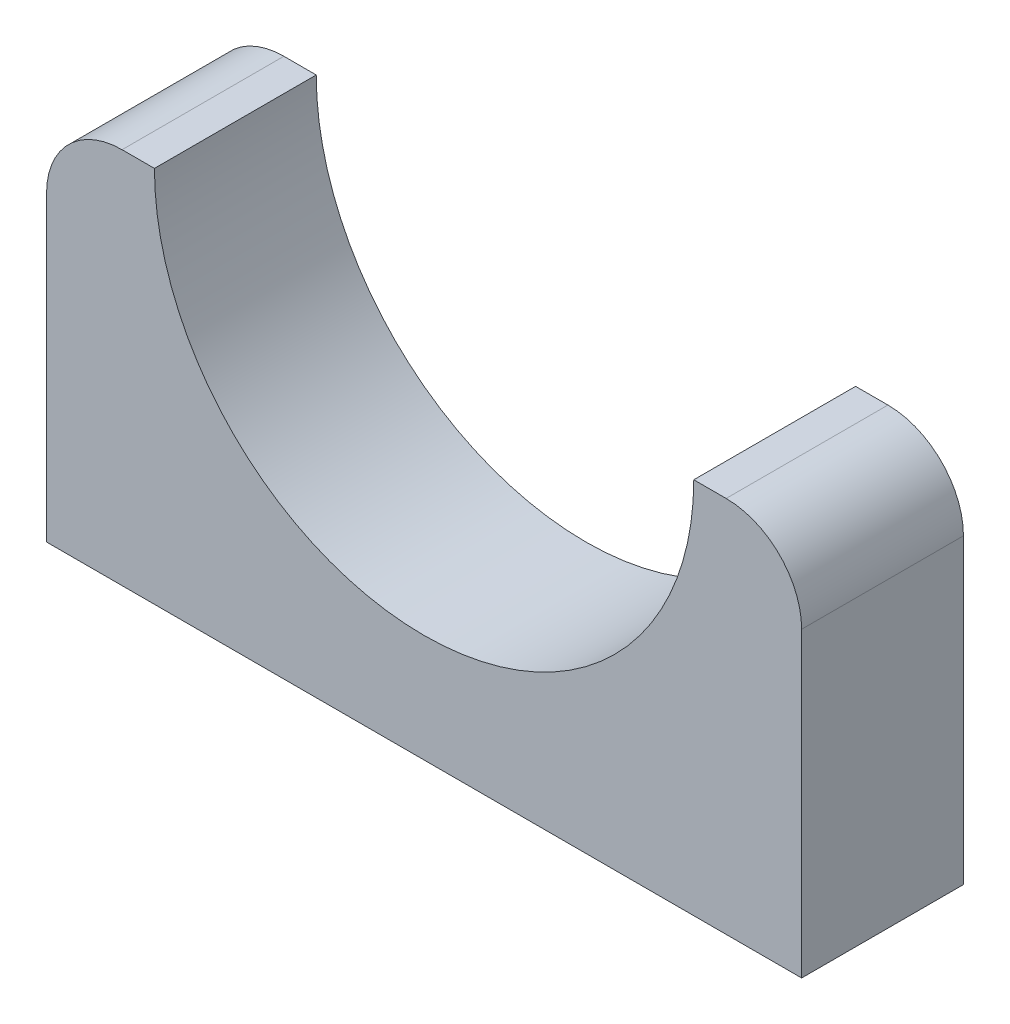
ISO-10303-21;
HEADER;
FILE_DESCRIPTION(('STEP AP214'),'2;1');
FILE_NAME('part.step','',(''),(''),'','','');
FILE_SCHEMA(('AUTOMOTIVE_DESIGN { 1 0 10303 214 1 1 1 1 }'));
ENDSEC;
DATA;
#1=APPLICATION_CONTEXT('core data for automotive mechanical design processes');
#2=APPLICATION_PROTOCOL_DEFINITION('international standard','automotive_design',2000,#1);
#3=PRODUCT_CONTEXT('',#1,'mechanical');
#4=PRODUCT('Part','Part','',(#3));
#5=PRODUCT_RELATED_PRODUCT_CATEGORY('part','',(#4));
#6=PRODUCT_DEFINITION_FORMATION('','',#4);
#7=PRODUCT_DEFINITION_CONTEXT('part definition',#1,'design');
#8=PRODUCT_DEFINITION('design','',#6,#7);
#9=PRODUCT_DEFINITION_SHAPE('','',#8);
#10=(LENGTH_UNIT() NAMED_UNIT(*) SI_UNIT(.MILLI.,.METRE.));
#11=(NAMED_UNIT(*) PLANE_ANGLE_UNIT() SI_UNIT($,.RADIAN.));
#12=(NAMED_UNIT(*) SI_UNIT($,.STERADIAN.) SOLID_ANGLE_UNIT());
#13=UNCERTAINTY_MEASURE_WITH_UNIT(LENGTH_MEASURE(1.E-05),#10,'distance_accuracy_value','');
#14=(GEOMETRIC_REPRESENTATION_CONTEXT(3) GLOBAL_UNCERTAINTY_ASSIGNED_CONTEXT((#13)) GLOBAL_UNIT_ASSIGNED_CONTEXT((#10,
#11,#12)) REPRESENTATION_CONTEXT('',''));
#15=CARTESIAN_POINT('',(0.,0.,0.));
#16=DIRECTION('',(0.,0.,1.));
#17=DIRECTION('',(1.,0.,0.));
#18=AXIS2_PLACEMENT_3D('',#15,#16,#17);
#19=CARTESIAN_POINT('',(17.5,0.,7.5));
#20=DIRECTION('',(-1.,0.,0.));
#21=DIRECTION('',(0.,0.,1.));
#22=AXIS2_PLACEMENT_3D('',#19,#20,#21);
#23=PLANE('',#22);
#24=DIRECTION('',(0.,1.,0.));
#25=VECTOR('',#24,1.);
#26=CARTESIAN_POINT('',(17.5,0.,0.));
#27=LINE('',#26,#25);
#28=CARTESIAN_POINT('',(17.5,0.,0.));
#29=VERTEX_POINT('',#28);
#30=CARTESIAN_POINT('',(17.5,14.,0.));
#31=VERTEX_POINT('',#30);
#32=EDGE_CURVE('E136',#29,#31,#27,.T.);
#33=ORIENTED_EDGE('',*,*,#32,.T.);
#34=DIRECTION('',(0.,0.,-1.));
#35=VECTOR('',#34,1.);
#36=CARTESIAN_POINT('',(17.5,14.,7.5));
#37=LINE('',#36,#35);
#38=CARTESIAN_POINT('',(17.5,14.,7.5));
#39=VERTEX_POINT('',#38);
#40=EDGE_CURVE('E159',#31,#39,#37,.F.);
#41=ORIENTED_EDGE('',*,*,#40,.T.);
#42=DIRECTION('',(0.,1.,0.));
#43=VECTOR('',#42,1.);
#44=CARTESIAN_POINT('',(17.5,0.,7.5));
#45=LINE('',#44,#43);
#46=CARTESIAN_POINT('',(17.5,0.,7.5));
#47=VERTEX_POINT('',#46);
#48=EDGE_CURVE('E112',#47,#39,#45,.T.);
#49=ORIENTED_EDGE('',*,*,#48,.F.);
#50=DIRECTION('',(0.,0.,-1.));
#51=VECTOR('',#50,1.);
#52=CARTESIAN_POINT('',(17.5,0.,7.5));
#53=LINE('',#52,#51);
#54=EDGE_CURVE('E135',#47,#29,#53,.T.);
#55=ORIENTED_EDGE('',*,*,#54,.T.);
#56=EDGE_LOOP('',(#33,#41,#49,#55));
#57=FACE_BOUND('',#56,.T.);
#58=ADVANCED_FACE('F37',(#57),#23,.F.);
#59=CARTESIAN_POINT('',(17.5,17.5,7.5));
#60=DIRECTION('',(0.,-1.,0.));
#61=DIRECTION('',(1.,0.,0.));
#62=AXIS2_PLACEMENT_3D('',#59,#60,#61);
#63=PLANE('',#62);
#64=DIRECTION('',(-1.,0.,0.));
#65=VECTOR('',#64,1.);
#66=CARTESIAN_POINT('',(17.5,17.5,7.5));
#67=LINE('',#66,#65);
#68=CARTESIAN_POINT('',(14.,17.5,7.5));
#69=VERTEX_POINT('',#68);
#70=CARTESIAN_POINT('',(12.5,17.5,7.5));
#71=VERTEX_POINT('',#70);
#72=EDGE_CURVE('E100',#69,#71,#67,.T.);
#73=ORIENTED_EDGE('',*,*,#72,.F.);
#74=DIRECTION('',(0.,0.,-1.));
#75=VECTOR('',#74,1.);
#76=CARTESIAN_POINT('',(14.,17.5,7.5));
#77=LINE('',#76,#75);
#78=CARTESIAN_POINT('',(14.,17.5,0.));
#79=VERTEX_POINT('',#78);
#80=EDGE_CURVE('E121',#69,#79,#77,.T.);
#81=ORIENTED_EDGE('',*,*,#80,.T.);
#82=DIRECTION('',(-1.,0.,0.));
#83=VECTOR('',#82,1.);
#84=CARTESIAN_POINT('',(17.5,17.5,0.));
#85=LINE('',#84,#83);
#86=CARTESIAN_POINT('',(12.5,17.5,0.));
#87=VERTEX_POINT('',#86);
#88=EDGE_CURVE('E118',#79,#87,#85,.T.);
#89=ORIENTED_EDGE('',*,*,#88,.T.);
#90=DIRECTION('',(0.,0.,-1.));
#91=VECTOR('',#90,1.);
#92=CARTESIAN_POINT('',(12.5,17.5,7.5));
#93=LINE('',#92,#91);
#94=EDGE_CURVE('E115',#71,#87,#93,.T.);
#95=ORIENTED_EDGE('',*,*,#94,.F.);
#96=EDGE_LOOP('',(#73,#81,#89,#95));
#97=FACE_BOUND('',#96,.T.);
#98=ADVANCED_FACE('F116',(#97),#63,.F.);
#99=CARTESIAN_POINT('',(0.,17.5,7.5));
#100=DIRECTION('',(0.,0.,-1.));
#101=DIRECTION('',(-1.,0.,0.));
#102=AXIS2_PLACEMENT_3D('',#99,#100,#101);
#103=CYLINDRICAL_SURFACE('',#102,12.5);
#104=CARTESIAN_POINT('',(0.,17.5,0.));
#105=DIRECTION('',(0.,0.,-1.));
#106=DIRECTION('',(1.,0.,0.));
#107=AXIS2_PLACEMENT_3D('',#104,#105,#106);
#108=CIRCLE('',#107,12.5);
#109=CARTESIAN_POINT('',(-12.5,17.5,0.));
#110=VERTEX_POINT('',#109);
#111=EDGE_CURVE('E140',#87,#110,#108,.T.);
#112=ORIENTED_EDGE('',*,*,#111,.T.);
#113=DIRECTION('',(0.,0.,-1.));
#114=VECTOR('',#113,1.);
#115=CARTESIAN_POINT('',(-12.5,17.5,7.5));
#116=LINE('',#115,#114);
#117=CARTESIAN_POINT('',(-12.5,17.5,7.5));
#118=VERTEX_POINT('',#117);
#119=EDGE_CURVE('E122',#118,#110,#116,.T.);
#120=ORIENTED_EDGE('',*,*,#119,.F.);
#121=CARTESIAN_POINT('',(0.,17.5,7.5));
#122=DIRECTION('',(0.,0.,-1.));
#123=DIRECTION('',(1.,0.,0.));
#124=AXIS2_PLACEMENT_3D('',#121,#122,#123);
#125=CIRCLE('',#124,12.5);
#126=EDGE_CURVE('E105',#71,#118,#125,.T.);
#127=ORIENTED_EDGE('',*,*,#126,.F.);
#128=ORIENTED_EDGE('',*,*,#94,.T.);
#129=EDGE_LOOP('',(#112,#120,#127,#128));
#130=FACE_BOUND('',#129,.T.);
#131=ADVANCED_FACE('F124',(#130),#103,.F.);
#132=CARTESIAN_POINT('',(-17.5,17.5,7.5));
#133=DIRECTION('',(0.,-1.,0.));
#134=DIRECTION('',(0.,0.,-1.));
#135=AXIS2_PLACEMENT_3D('',#132,#133,#134);
#136=PLANE('',#135);
#137=DIRECTION('',(-1.,0.,0.));
#138=VECTOR('',#137,1.);
#139=CARTESIAN_POINT('',(-17.5,17.5,0.));
#140=LINE('',#139,#138);
#141=CARTESIAN_POINT('',(-14.,17.5,0.));
#142=VERTEX_POINT('',#141);
#143=EDGE_CURVE('E142',#110,#142,#140,.T.);
#144=ORIENTED_EDGE('',*,*,#143,.T.);
#145=DIRECTION('',(0.,0.,-1.));
#146=VECTOR('',#145,1.);
#147=CARTESIAN_POINT('',(-14.,17.5,7.5));
#148=LINE('',#147,#146);
#149=CARTESIAN_POINT('',(-14.,17.5,7.5));
#150=VERTEX_POINT('',#149);
#151=EDGE_CURVE('E11',#142,#150,#148,.F.);
#152=ORIENTED_EDGE('',*,*,#151,.T.);
#153=DIRECTION('',(-1.,0.,0.));
#154=VECTOR('',#153,1.);
#155=CARTESIAN_POINT('',(-17.5,17.5,7.5));
#156=LINE('',#155,#154);
#157=EDGE_CURVE('E126',#118,#150,#156,.T.);
#158=ORIENTED_EDGE('',*,*,#157,.F.);
#159=ORIENTED_EDGE('',*,*,#119,.T.);
#160=EDGE_LOOP('',(#144,#152,#158,#159));
#161=FACE_BOUND('',#160,.T.);
#162=ADVANCED_FACE('F183',(#161),#136,.F.);
#163=CARTESIAN_POINT('',(-17.5,0.,7.5));
#164=DIRECTION('',(1.,0.,0.));
#165=DIRECTION('',(0.,0.,-1.));
#166=AXIS2_PLACEMENT_3D('',#163,#164,#165);
#167=PLANE('',#166);
#168=DIRECTION('',(0.,-1.,0.));
#169=VECTOR('',#168,1.);
#170=CARTESIAN_POINT('',(-17.5,0.,7.5));
#171=LINE('',#170,#169);
#172=CARTESIAN_POINT('',(-17.5,14.,7.5));
#173=VERTEX_POINT('',#172);
#174=CARTESIAN_POINT('',(-17.5,0.,7.5));
#175=VERTEX_POINT('',#174);
#176=EDGE_CURVE('E128',#173,#175,#171,.T.);
#177=ORIENTED_EDGE('',*,*,#176,.F.);
#178=DIRECTION('',(0.,0.,-1.));
#179=VECTOR('',#178,1.);
#180=CARTESIAN_POINT('',(-17.5,14.,7.5));
#181=LINE('',#180,#179);
#182=CARTESIAN_POINT('',(-17.5,14.,0.));
#183=VERTEX_POINT('',#182);
#184=EDGE_CURVE('E45',#173,#183,#181,.T.);
#185=ORIENTED_EDGE('',*,*,#184,.T.);
#186=DIRECTION('',(0.,-1.,0.));
#187=VECTOR('',#186,1.);
#188=CARTESIAN_POINT('',(-17.5,0.,0.));
#189=LINE('',#188,#187);
#190=CARTESIAN_POINT('',(-17.5,0.,0.));
#191=VERTEX_POINT('',#190);
#192=EDGE_CURVE('E144',#183,#191,#189,.T.);
#193=ORIENTED_EDGE('',*,*,#192,.T.);
#194=DIRECTION('',(0.,0.,-1.));
#195=VECTOR('',#194,1.);
#196=CARTESIAN_POINT('',(-17.5,0.,7.5));
#197=LINE('',#196,#195);
#198=EDGE_CURVE('E150',#175,#191,#197,.T.);
#199=ORIENTED_EDGE('',*,*,#198,.F.);
#200=EDGE_LOOP('',(#177,#185,#193,#199));
#201=FACE_BOUND('',#200,.T.);
#202=ADVANCED_FACE('F166',(#201),#167,.F.);
#203=CARTESIAN_POINT('',(-17.5,0.,7.5));
#204=DIRECTION('',(0.,1.,0.));
#205=DIRECTION('',(0.,0.,1.));
#206=AXIS2_PLACEMENT_3D('',#203,#204,#205);
#207=PLANE('',#206);
#208=DIRECTION('',(1.,0.,0.));
#209=VECTOR('',#208,1.);
#210=CARTESIAN_POINT('',(-17.5,0.,0.));
#211=LINE('',#210,#209);
#212=EDGE_CURVE('E146',#191,#29,#211,.T.);
#213=ORIENTED_EDGE('',*,*,#212,.T.);
#214=ORIENTED_EDGE('',*,*,#54,.F.);
#215=DIRECTION('',(1.,0.,0.));
#216=VECTOR('',#215,1.);
#217=CARTESIAN_POINT('',(-17.5,0.,7.5));
#218=LINE('',#217,#216);
#219=EDGE_CURVE('E133',#175,#47,#218,.T.);
#220=ORIENTED_EDGE('',*,*,#219,.F.);
#221=ORIENTED_EDGE('',*,*,#198,.T.);
#222=EDGE_LOOP('',(#213,#214,#220,#221));
#223=FACE_BOUND('',#222,.T.);
#224=ADVANCED_FACE('F176',(#223),#207,.F.);
#225=CARTESIAN_POINT('',(0.,17.5,7.5));
#226=DIRECTION('',(0.,0.,1.));
#227=DIRECTION('',(1.,0.,0.));
#228=AXIS2_PLACEMENT_3D('',#225,#226,#227);
#229=PLANE('',#228);
#230=ORIENTED_EDGE('',*,*,#48,.T.);
#231=CARTESIAN_POINT('',(14.,14.,7.5));
#232=DIRECTION('',(0.,0.,1.));
#233=DIRECTION('',(1.,0.,0.));
#234=AXIS2_PLACEMENT_3D('',#231,#232,#233);
#235=CIRCLE('',#234,3.5);
#236=EDGE_CURVE('E108',#39,#69,#235,.T.);
#237=ORIENTED_EDGE('',*,*,#236,.T.);
#238=ORIENTED_EDGE('',*,*,#72,.T.);
#239=ORIENTED_EDGE('',*,*,#126,.T.);
#240=ORIENTED_EDGE('',*,*,#157,.T.);
#241=CARTESIAN_POINT('',(-14.,14.,7.5));
#242=DIRECTION('',(0.,0.,1.));
#243=DIRECTION('',(1.,0.,0.));
#244=AXIS2_PLACEMENT_3D('',#241,#242,#243);
#245=CIRCLE('',#244,3.5);
#246=EDGE_CURVE('E52',#150,#173,#245,.T.);
#247=ORIENTED_EDGE('',*,*,#246,.T.);
#248=ORIENTED_EDGE('',*,*,#176,.T.);
#249=ORIENTED_EDGE('',*,*,#219,.T.);
#250=EDGE_LOOP('',(#230,#237,#238,#239,#240,#247,#248,#249));
#251=FACE_BOUND('',#250,.T.);
#252=ADVANCED_FACE('F103',(#251),#229,.T.);
#253=CARTESIAN_POINT('',(0.,17.5,0.));
#254=DIRECTION('',(0.,0.,1.));
#255=DIRECTION('',(1.,0.,0.));
#256=AXIS2_PLACEMENT_3D('',#253,#254,#255);
#257=PLANE('',#256);
#258=ORIENTED_EDGE('',*,*,#88,.F.);
#259=CARTESIAN_POINT('',(14.,14.,0.));
#260=DIRECTION('',(0.,0.,1.));
#261=DIRECTION('',(1.,0.,0.));
#262=AXIS2_PLACEMENT_3D('',#259,#260,#261);
#263=CIRCLE('',#262,3.5);
#264=EDGE_CURVE('E157',#79,#31,#263,.F.);
#265=ORIENTED_EDGE('',*,*,#264,.T.);
#266=ORIENTED_EDGE('',*,*,#32,.F.);
#267=ORIENTED_EDGE('',*,*,#212,.F.);
#268=ORIENTED_EDGE('',*,*,#192,.F.);
#269=CARTESIAN_POINT('',(-14.,14.,0.));
#270=DIRECTION('',(0.,0.,1.));
#271=DIRECTION('',(1.,0.,0.));
#272=AXIS2_PLACEMENT_3D('',#269,#270,#271);
#273=CIRCLE('',#272,3.5);
#274=EDGE_CURVE('E155',#183,#142,#273,.F.);
#275=ORIENTED_EDGE('',*,*,#274,.T.);
#276=ORIENTED_EDGE('',*,*,#143,.F.);
#277=ORIENTED_EDGE('',*,*,#111,.F.);
#278=EDGE_LOOP('',(#258,#265,#266,#267,#268,#275,#276,#277));
#279=FACE_BOUND('',#278,.T.);
#280=ADVANCED_FACE('F171',(#279),#257,.F.);
#281=CARTESIAN_POINT('',(14.,14.,7.5));
#282=DIRECTION('',(0.,0.,-1.));
#283=DIRECTION('',(-1.,0.,0.));
#284=AXIS2_PLACEMENT_3D('',#281,#282,#283);
#285=CYLINDRICAL_SURFACE('',#284,3.5);
#286=ORIENTED_EDGE('',*,*,#236,.F.);
#287=ORIENTED_EDGE('',*,*,#40,.F.);
#288=ORIENTED_EDGE('',*,*,#264,.F.);
#289=ORIENTED_EDGE('',*,*,#80,.F.);
#290=EDGE_LOOP('',(#286,#287,#288,#289));
#291=FACE_BOUND('',#290,.T.);
#292=ADVANCED_FACE('F182',(#291),#285,.T.);
#293=CARTESIAN_POINT('',(-14.,14.,7.5));
#294=DIRECTION('',(0.,0.,-1.));
#295=DIRECTION('',(-1.,0.,0.));
#296=AXIS2_PLACEMENT_3D('',#293,#294,#295);
#297=CYLINDRICAL_SURFACE('',#296,3.5);
#298=ORIENTED_EDGE('',*,*,#246,.F.);
#299=ORIENTED_EDGE('',*,*,#151,.F.);
#300=ORIENTED_EDGE('',*,*,#274,.F.);
#301=ORIENTED_EDGE('',*,*,#184,.F.);
#302=EDGE_LOOP('',(#298,#299,#300,#301));
#303=FACE_BOUND('',#302,.T.);
#304=ADVANCED_FACE('F39',(#303),#297,.T.);
#305=CLOSED_SHELL('',(#58,#98,#131,#162,#202,#224,#252,#280,#292,#304));
#306=MANIFOLD_SOLID_BREP('B2',#305);
#307=ADVANCED_BREP_SHAPE_REPRESENTATION('',(#18,#306),#14);
#308=SHAPE_DEFINITION_REPRESENTATION(#9,#307);
ENDSEC;
END-ISO-10303-21;
